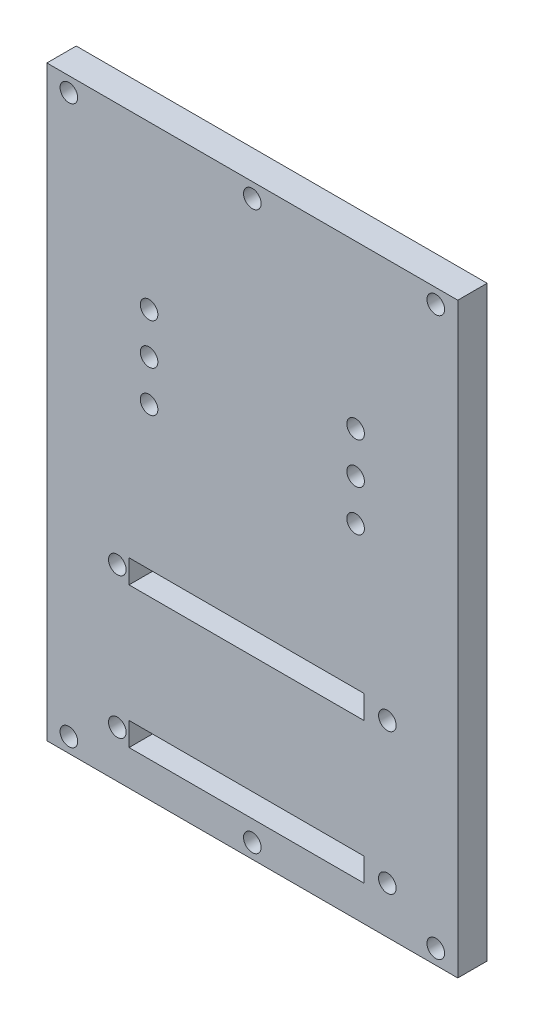
ISO-10303-21;
HEADER;
FILE_DESCRIPTION(('STEP AP214'),'2;1');
FILE_NAME('part.step','',(''),(''),'','','');
FILE_SCHEMA(('AUTOMOTIVE_DESIGN { 1 0 10303 214 1 1 1 1 }'));
ENDSEC;
DATA;
#1=APPLICATION_CONTEXT('core data for automotive mechanical design processes');
#2=APPLICATION_PROTOCOL_DEFINITION('international standard','automotive_design',2000,#1);
#3=PRODUCT_CONTEXT('',#1,'mechanical');
#4=PRODUCT('Part','Part','',(#3));
#5=PRODUCT_RELATED_PRODUCT_CATEGORY('part','',(#4));
#6=PRODUCT_DEFINITION_FORMATION('','',#4);
#7=PRODUCT_DEFINITION_CONTEXT('part definition',#1,'design');
#8=PRODUCT_DEFINITION('design','',#6,#7);
#9=PRODUCT_DEFINITION_SHAPE('','',#8);
#10=(LENGTH_UNIT() NAMED_UNIT(*) SI_UNIT(.MILLI.,.METRE.));
#11=(NAMED_UNIT(*) PLANE_ANGLE_UNIT() SI_UNIT($,.RADIAN.));
#12=(NAMED_UNIT(*) SI_UNIT($,.STERADIAN.) SOLID_ANGLE_UNIT());
#13=UNCERTAINTY_MEASURE_WITH_UNIT(LENGTH_MEASURE(1.E-05),#10,'distance_accuracy_value','');
#14=(GEOMETRIC_REPRESENTATION_CONTEXT(3) GLOBAL_UNCERTAINTY_ASSIGNED_CONTEXT((#13)) GLOBAL_UNIT_ASSIGNED_CONTEXT((#10,
#11,#12)) REPRESENTATION_CONTEXT('',''));
#15=CARTESIAN_POINT('',(0.,0.,0.));
#16=DIRECTION('',(0.,0.,1.));
#17=DIRECTION('',(1.,0.,0.));
#18=AXIS2_PLACEMENT_3D('',#15,#16,#17);
#19=CARTESIAN_POINT('',(0.,0.,2.5));
#20=DIRECTION('',(0.,0.,-1.));
#21=DIRECTION('',(-1.,0.,0.));
#22=AXIS2_PLACEMENT_3D('',#19,#20,#21);
#23=PLANE('',#22);
#24=CARTESIAN_POINT('',(23.,-42.,2.5));
#25=DIRECTION('',(0.,0.,1.));
#26=DIRECTION('',(1.,0.,0.));
#27=AXIS2_PLACEMENT_3D('',#24,#25,#26);
#28=CIRCLE('',#27,1.5);
#29=CARTESIAN_POINT('',(24.5,-42.,2.5));
#30=VERTEX_POINT('',#29);
#31=EDGE_CURVE('E181',#30,#30,#28,.T.);
#32=ORIENTED_EDGE('',*,*,#31,.F.);
#33=EDGE_LOOP('',(#32));
#34=FACE_BOUND('',#33,.T.);
#35=CARTESIAN_POINT('',(-17.5949785190877,15.3212862437457,2.5));
#36=DIRECTION('',(0.,0.,1.));
#37=DIRECTION('',(1.,0.,0.));
#38=AXIS2_PLACEMENT_3D('',#35,#36,#37);
#39=CIRCLE('',#38,1.5);
#40=CARTESIAN_POINT('',(-16.0949785190877,15.3212862437457,2.5));
#41=VERTEX_POINT('',#40);
#42=EDGE_CURVE('E176',#41,#41,#39,.T.);
#43=ORIENTED_EDGE('',*,*,#42,.F.);
#44=EDGE_LOOP('',(#43));
#45=FACE_BOUND('',#44,.T.);
#46=CARTESIAN_POINT('',(-17.5949785190877,22.3212862437471,2.5));
#47=DIRECTION('',(0.,0.,1.));
#48=DIRECTION('',(1.,0.,0.));
#49=AXIS2_PLACEMENT_3D('',#46,#47,#48);
#50=CIRCLE('',#49,1.5);
#51=CARTESIAN_POINT('',(-16.0949785190877,22.3212862437471,2.5));
#52=VERTEX_POINT('',#51);
#53=EDGE_CURVE('E178',#52,#52,#50,.T.);
#54=ORIENTED_EDGE('',*,*,#53,.F.);
#55=EDGE_LOOP('',(#54));
#56=FACE_BOUND('',#55,.T.);
#57=CARTESIAN_POINT('',(-17.5949785190876,8.32128624374423,2.5));
#58=DIRECTION('',(0.,0.,1.));
#59=DIRECTION('',(1.,0.,0.));
#60=AXIS2_PLACEMENT_3D('',#57,#58,#59);
#61=CIRCLE('',#60,1.5);
#62=CARTESIAN_POINT('',(-16.0949785190876,8.32128624374423,2.5));
#63=VERTEX_POINT('',#62);
#64=EDGE_CURVE('E147',#63,#63,#61,.T.);
#65=ORIENTED_EDGE('',*,*,#64,.F.);
#66=EDGE_LOOP('',(#65));
#67=FACE_BOUND('',#66,.T.);
#68=DIRECTION('',(0.,-1.,0.));
#69=VECTOR('',#68,1.);
#70=CARTESIAN_POINT('',(19.,-16.,2.5));
#71=LINE('',#70,#69);
#72=CARTESIAN_POINT('',(19.,-16.,2.5));
#73=VERTEX_POINT('',#72);
#74=CARTESIAN_POINT('',(19.,-20.,2.5));
#75=VERTEX_POINT('',#74);
#76=EDGE_CURVE('E149',#73,#75,#71,.T.);
#77=ORIENTED_EDGE('',*,*,#76,.T.);
#78=DIRECTION('',(1.,0.,0.));
#79=VECTOR('',#78,1.);
#80=CARTESIAN_POINT('',(-21.,-20.,2.5));
#81=LINE('',#80,#79);
#82=CARTESIAN_POINT('',(-21.,-20.,2.5));
#83=VERTEX_POINT('',#82);
#84=EDGE_CURVE('E54',#83,#75,#81,.T.);
#85=ORIENTED_EDGE('',*,*,#84,.F.);
#86=DIRECTION('',(0.,-1.,0.));
#87=VECTOR('',#86,1.);
#88=CARTESIAN_POINT('',(-21.,-16.,2.5));
#89=LINE('',#88,#87);
#90=CARTESIAN_POINT('',(-21.,-16.,2.5));
#91=VERTEX_POINT('',#90);
#92=EDGE_CURVE('E140',#91,#83,#89,.T.);
#93=ORIENTED_EDGE('',*,*,#92,.F.);
#94=DIRECTION('',(1.,0.,0.));
#95=VECTOR('',#94,1.);
#96=CARTESIAN_POINT('',(-21.,-16.,2.5));
#97=LINE('',#96,#95);
#98=EDGE_CURVE('E141',#91,#73,#97,.T.);
#99=ORIENTED_EDGE('',*,*,#98,.T.);
#100=EDGE_LOOP('',(#77,#85,#93,#99));
#101=FACE_BOUND('',#100,.T.);
#102=CARTESIAN_POINT('',(31.25,-47.5,2.5));
#103=DIRECTION('',(0.,0.,1.));
#104=DIRECTION('',(-1.,0.,0.));
#105=AXIS2_PLACEMENT_3D('',#102,#103,#104);
#106=CIRCLE('',#105,1.5);
#107=CARTESIAN_POINT('',(29.75,-47.5,2.5));
#108=VERTEX_POINT('',#107);
#109=EDGE_CURVE('E201',#108,#108,#106,.T.);
#110=ORIENTED_EDGE('',*,*,#109,.F.);
#111=EDGE_LOOP('',(#110));
#112=FACE_BOUND('',#111,.T.);
#113=CARTESIAN_POINT('',(-31.25,-47.5,2.5));
#114=DIRECTION('',(0.,0.,-1.));
#115=DIRECTION('',(1.,0.,0.));
#116=AXIS2_PLACEMENT_3D('',#113,#114,#115);
#117=CIRCLE('',#116,1.5);
#118=CARTESIAN_POINT('',(-29.75,-47.5,2.5));
#119=VERTEX_POINT('',#118);
#120=EDGE_CURVE('E210',#119,#119,#117,.T.);
#121=ORIENTED_EDGE('',*,*,#120,.T.);
#122=EDGE_LOOP('',(#121));
#123=FACE_BOUND('',#122,.T.);
#124=CARTESIAN_POINT('',(0.,-47.5,2.5));
#125=DIRECTION('',(0.,0.,-1.));
#126=DIRECTION('',(1.,0.,0.));
#127=AXIS2_PLACEMENT_3D('',#124,#125,#126);
#128=CIRCLE('',#127,1.5);
#129=CARTESIAN_POINT('',(1.5,-47.5,2.5));
#130=VERTEX_POINT('',#129);
#131=EDGE_CURVE('E209',#130,#130,#128,.T.);
#132=ORIENTED_EDGE('',*,*,#131,.T.);
#133=EDGE_LOOP('',(#132));
#134=FACE_BOUND('',#133,.T.);
#135=CARTESIAN_POINT('',(-31.25,47.5,2.5));
#136=DIRECTION('',(0.,0.,1.));
#137=DIRECTION('',(1.,0.,0.));
#138=AXIS2_PLACEMENT_3D('',#135,#136,#137);
#139=CIRCLE('',#138,1.5);
#140=CARTESIAN_POINT('',(-29.75,47.5,2.5));
#141=VERTEX_POINT('',#140);
#142=EDGE_CURVE('E220',#141,#141,#139,.T.);
#143=ORIENTED_EDGE('',*,*,#142,.F.);
#144=EDGE_LOOP('',(#143));
#145=FACE_BOUND('',#144,.T.);
#146=CARTESIAN_POINT('',(0.,47.5,2.5));
#147=DIRECTION('',(0.,0.,1.));
#148=DIRECTION('',(1.,0.,0.));
#149=AXIS2_PLACEMENT_3D('',#146,#147,#148);
#150=CIRCLE('',#149,1.5);
#151=CARTESIAN_POINT('',(1.5,47.5,2.5));
#152=VERTEX_POINT('',#151);
#153=EDGE_CURVE('E219',#152,#152,#150,.T.);
#154=ORIENTED_EDGE('',*,*,#153,.F.);
#155=EDGE_LOOP('',(#154));
#156=FACE_BOUND('',#155,.T.);
#157=DIRECTION('',(0.,1.,0.));
#158=VECTOR('',#157,1.);
#159=CARTESIAN_POINT('',(35.,-50.,2.5));
#160=LINE('',#159,#158);
#161=CARTESIAN_POINT('',(35.,-50.,2.5));
#162=VERTEX_POINT('',#161);
#163=CARTESIAN_POINT('',(35.,50.,2.5));
#164=VERTEX_POINT('',#163);
#165=EDGE_CURVE('E221',#162,#164,#160,.T.);
#166=ORIENTED_EDGE('',*,*,#165,.T.);
#167=DIRECTION('',(-1.,0.,0.));
#168=VECTOR('',#167,1.);
#169=CARTESIAN_POINT('',(-35.,50.,2.5));
#170=LINE('',#169,#168);
#171=CARTESIAN_POINT('',(-35.,50.,2.5));
#172=VERTEX_POINT('',#171);
#173=EDGE_CURVE('E229',#164,#172,#170,.T.);
#174=ORIENTED_EDGE('',*,*,#173,.T.);
#175=DIRECTION('',(0.,-1.,0.));
#176=VECTOR('',#175,1.);
#177=CARTESIAN_POINT('',(-35.,-50.,2.5));
#178=LINE('',#177,#176);
#179=CARTESIAN_POINT('',(-35.,-50.,2.5));
#180=VERTEX_POINT('',#179);
#181=EDGE_CURVE('E226',#172,#180,#178,.T.);
#182=ORIENTED_EDGE('',*,*,#181,.T.);
#183=DIRECTION('',(1.,0.,0.));
#184=VECTOR('',#183,1.);
#185=CARTESIAN_POINT('',(-35.,-50.,2.5));
#186=LINE('',#185,#184);
#187=EDGE_CURVE('E235',#180,#162,#186,.T.);
#188=ORIENTED_EDGE('',*,*,#187,.T.);
#189=EDGE_LOOP('',(#166,#174,#182,#188));
#190=FACE_BOUND('',#189,.T.);
#191=CARTESIAN_POINT('',(31.25,47.5,2.5));
#192=DIRECTION('',(0.,0.,-1.));
#193=DIRECTION('',(-1.,0.,0.));
#194=AXIS2_PLACEMENT_3D('',#191,#192,#193);
#195=CIRCLE('',#194,1.5);
#196=CARTESIAN_POINT('',(29.75,47.5,2.5));
#197=VERTEX_POINT('',#196);
#198=EDGE_CURVE('E213',#197,#197,#195,.T.);
#199=ORIENTED_EDGE('',*,*,#198,.T.);
#200=EDGE_LOOP('',(#199));
#201=FACE_BOUND('',#200,.T.);
#202=CARTESIAN_POINT('',(-23.,-18.,2.5));
#203=DIRECTION('',(0.,0.,1.));
#204=DIRECTION('',(1.,0.,0.));
#205=AXIS2_PLACEMENT_3D('',#202,#203,#204);
#206=CIRCLE('',#205,1.5);
#207=CARTESIAN_POINT('',(-21.5,-18.,2.5));
#208=VERTEX_POINT('',#207);
#209=EDGE_CURVE('E191',#208,#208,#206,.T.);
#210=ORIENTED_EDGE('',*,*,#209,.F.);
#211=EDGE_LOOP('',(#210));
#212=FACE_BOUND('',#211,.T.);
#213=DIRECTION('',(0.,1.,0.));
#214=VECTOR('',#213,1.);
#215=CARTESIAN_POINT('',(-21.,-44.,2.5));
#216=LINE('',#215,#214);
#217=CARTESIAN_POINT('',(-21.,-44.,2.5));
#218=VERTEX_POINT('',#217);
#219=CARTESIAN_POINT('',(-21.,-40.,2.5));
#220=VERTEX_POINT('',#219);
#221=EDGE_CURVE('E62',#218,#220,#216,.T.);
#222=ORIENTED_EDGE('',*,*,#221,.T.);
#223=DIRECTION('',(1.,0.,0.));
#224=VECTOR('',#223,1.);
#225=CARTESIAN_POINT('',(-21.,-40.,2.5));
#226=LINE('',#225,#224);
#227=CARTESIAN_POINT('',(19.,-40.,2.5));
#228=VERTEX_POINT('',#227);
#229=EDGE_CURVE('E174',#220,#228,#226,.T.);
#230=ORIENTED_EDGE('',*,*,#229,.T.);
#231=DIRECTION('',(0.,1.,0.));
#232=VECTOR('',#231,1.);
#233=CARTESIAN_POINT('',(19.,-44.,2.5));
#234=LINE('',#233,#232);
#235=CARTESIAN_POINT('',(19.,-44.,2.5));
#236=VERTEX_POINT('',#235);
#237=EDGE_CURVE('E166',#236,#228,#234,.T.);
#238=ORIENTED_EDGE('',*,*,#237,.F.);
#239=DIRECTION('',(1.,0.,0.));
#240=VECTOR('',#239,1.);
#241=CARTESIAN_POINT('',(-21.,-44.,2.5));
#242=LINE('',#241,#240);
#243=EDGE_CURVE('E167',#218,#236,#242,.T.);
#244=ORIENTED_EDGE('',*,*,#243,.F.);
#245=EDGE_LOOP('',(#222,#230,#238,#244));
#246=FACE_BOUND('',#245,.T.);
#247=CARTESIAN_POINT('',(17.5949785190876,8.32128624374423,2.5));
#248=DIRECTION('',(0.,0.,-1.));
#249=DIRECTION('',(-1.,0.,0.));
#250=AXIS2_PLACEMENT_3D('',#247,#248,#249);
#251=CIRCLE('',#250,1.5);
#252=CARTESIAN_POINT('',(16.0949785190876,8.32128624374423,2.5));
#253=VERTEX_POINT('',#252);
#254=EDGE_CURVE('E187',#253,#253,#251,.T.);
#255=ORIENTED_EDGE('',*,*,#254,.T.);
#256=EDGE_LOOP('',(#255));
#257=FACE_BOUND('',#256,.T.);
#258=CARTESIAN_POINT('',(17.5949785190877,15.3212862437457,2.5));
#259=DIRECTION('',(0.,0.,-1.));
#260=DIRECTION('',(-1.,0.,0.));
#261=AXIS2_PLACEMENT_3D('',#258,#259,#260);
#262=CIRCLE('',#261,1.5);
#263=CARTESIAN_POINT('',(16.0949785190877,15.3212862437457,2.5));
#264=VERTEX_POINT('',#263);
#265=EDGE_CURVE('E195',#264,#264,#262,.T.);
#266=ORIENTED_EDGE('',*,*,#265,.T.);
#267=EDGE_LOOP('',(#266));
#268=FACE_BOUND('',#267,.T.);
#269=CARTESIAN_POINT('',(17.5949785190877,22.3212862437471,2.5));
#270=DIRECTION('',(0.,0.,-1.));
#271=DIRECTION('',(-1.,0.,0.));
#272=AXIS2_PLACEMENT_3D('',#269,#270,#271);
#273=CIRCLE('',#272,1.5);
#274=CARTESIAN_POINT('',(16.0949785190877,22.3212862437471,2.5));
#275=VERTEX_POINT('',#274);
#276=EDGE_CURVE('E194',#275,#275,#273,.T.);
#277=ORIENTED_EDGE('',*,*,#276,.T.);
#278=EDGE_LOOP('',(#277));
#279=FACE_BOUND('',#278,.T.);
#280=CARTESIAN_POINT('',(-23.,-42.,2.5));
#281=DIRECTION('',(0.,0.,-1.));
#282=DIRECTION('',(-1.,0.,0.));
#283=AXIS2_PLACEMENT_3D('',#280,#281,#282);
#284=CIRCLE('',#283,1.5);
#285=CARTESIAN_POINT('',(-24.5,-42.,2.5));
#286=VERTEX_POINT('',#285);
#287=EDGE_CURVE('E179',#286,#286,#284,.T.);
#288=ORIENTED_EDGE('',*,*,#287,.T.);
#289=EDGE_LOOP('',(#288));
#290=FACE_BOUND('',#289,.T.);
#291=CARTESIAN_POINT('',(23.,-18.,2.5));
#292=DIRECTION('',(0.,0.,-1.));
#293=DIRECTION('',(-1.,0.,0.));
#294=AXIS2_PLACEMENT_3D('',#291,#292,#293);
#295=CIRCLE('',#294,1.5);
#296=CARTESIAN_POINT('',(21.5,-18.,2.5));
#297=VERTEX_POINT('',#296);
#298=EDGE_CURVE('E153',#297,#297,#295,.T.);
#299=ORIENTED_EDGE('',*,*,#298,.T.);
#300=EDGE_LOOP('',(#299));
#301=FACE_BOUND('',#300,.T.);
#302=ADVANCED_FACE('F36',(#34,#45,#56,#67,#101,#112,#123,#134,#145,#156,#190,#201,#212,#246,
#257,#268,#279,#290,#301),#23,.F.);
#303=CARTESIAN_POINT('',(0.,0.,-2.5));
#304=DIRECTION('',(0.,0.,-1.));
#305=DIRECTION('',(-1.,0.,0.));
#306=AXIS2_PLACEMENT_3D('',#303,#304,#305);
#307=PLANE('',#306);
#308=CARTESIAN_POINT('',(-23.,-42.,-2.5));
#309=DIRECTION('',(0.,0.,-1.));
#310=DIRECTION('',(-1.,0.,0.));
#311=AXIS2_PLACEMENT_3D('',#308,#309,#310);
#312=CIRCLE('',#311,1.5);
#313=CARTESIAN_POINT('',(-24.5,-42.,-2.5));
#314=VERTEX_POINT('',#313);
#315=EDGE_CURVE('E307',#314,#314,#312,.F.);
#316=ORIENTED_EDGE('',*,*,#315,.T.);
#317=EDGE_LOOP('',(#316));
#318=FACE_BOUND('',#317,.T.);
#319=CARTESIAN_POINT('',(-17.5949785190877,15.3212862437457,-2.5));
#320=DIRECTION('',(0.,0.,-1.));
#321=DIRECTION('',(-1.,0.,0.));
#322=AXIS2_PLACEMENT_3D('',#319,#320,#321);
#323=CIRCLE('',#322,1.5);
#324=CARTESIAN_POINT('',(-19.0949785190877,15.3212862437457,-2.5));
#325=VERTEX_POINT('',#324);
#326=EDGE_CURVE('E303',#325,#325,#323,.T.);
#327=ORIENTED_EDGE('',*,*,#326,.F.);
#328=EDGE_LOOP('',(#327));
#329=FACE_BOUND('',#328,.T.);
#330=CARTESIAN_POINT('',(-17.5949785190877,22.3212862437471,-2.5));
#331=DIRECTION('',(0.,0.,-1.));
#332=DIRECTION('',(-1.,0.,0.));
#333=AXIS2_PLACEMENT_3D('',#330,#331,#332);
#334=CIRCLE('',#333,1.5);
#335=CARTESIAN_POINT('',(-19.0949785190877,22.3212862437471,-2.5));
#336=VERTEX_POINT('',#335);
#337=EDGE_CURVE('E301',#336,#336,#334,.T.);
#338=ORIENTED_EDGE('',*,*,#337,.F.);
#339=EDGE_LOOP('',(#338));
#340=FACE_BOUND('',#339,.T.);
#341=CARTESIAN_POINT('',(17.5949785190877,15.3212862437457,-2.5));
#342=DIRECTION('',(0.,0.,-1.));
#343=DIRECTION('',(-1.,0.,0.));
#344=AXIS2_PLACEMENT_3D('',#341,#342,#343);
#345=CIRCLE('',#344,1.5);
#346=CARTESIAN_POINT('',(16.0949785190877,15.3212862437457,-2.5));
#347=VERTEX_POINT('',#346);
#348=EDGE_CURVE('E293',#347,#347,#345,.F.);
#349=ORIENTED_EDGE('',*,*,#348,.T.);
#350=EDGE_LOOP('',(#349));
#351=FACE_BOUND('',#350,.T.);
#352=DIRECTION('',(-1.,0.,0.));
#353=VECTOR('',#352,1.);
#354=CARTESIAN_POINT('',(0.,-40.,-2.5));
#355=LINE('',#354,#353);
#356=CARTESIAN_POINT('',(19.,-40.,-2.5));
#357=VERTEX_POINT('',#356);
#358=CARTESIAN_POINT('',(-21.,-40.,-2.5));
#359=VERTEX_POINT('',#358);
#360=EDGE_CURVE('E280',#357,#359,#355,.T.);
#361=ORIENTED_EDGE('',*,*,#360,.T.);
#362=DIRECTION('',(0.,-1.,0.));
#363=VECTOR('',#362,1.);
#364=CARTESIAN_POINT('',(-21.,0.,-2.5));
#365=LINE('',#364,#363);
#366=CARTESIAN_POINT('',(-21.,-44.,-2.5));
#367=VERTEX_POINT('',#366);
#368=EDGE_CURVE('E278',#359,#367,#365,.T.);
#369=ORIENTED_EDGE('',*,*,#368,.T.);
#370=DIRECTION('',(-1.,0.,0.));
#371=VECTOR('',#370,1.);
#372=CARTESIAN_POINT('',(0.,-44.,-2.5));
#373=LINE('',#372,#371);
#374=CARTESIAN_POINT('',(19.,-44.,-2.5));
#375=VERTEX_POINT('',#374);
#376=EDGE_CURVE('E254',#375,#367,#373,.T.);
#377=ORIENTED_EDGE('',*,*,#376,.F.);
#378=DIRECTION('',(0.,-1.,0.));
#379=VECTOR('',#378,1.);
#380=CARTESIAN_POINT('',(19.,0.,-2.5));
#381=LINE('',#380,#379);
#382=EDGE_CURVE('E273',#357,#375,#381,.T.);
#383=ORIENTED_EDGE('',*,*,#382,.F.);
#384=EDGE_LOOP('',(#361,#369,#377,#383));
#385=FACE_BOUND('',#384,.T.);
#386=CARTESIAN_POINT('',(31.25,-47.5,-2.5));
#387=DIRECTION('',(0.,0.,-1.));
#388=DIRECTION('',(-1.,0.,0.));
#389=AXIS2_PLACEMENT_3D('',#386,#387,#388);
#390=CIRCLE('',#389,1.5);
#391=CARTESIAN_POINT('',(29.75,-47.5,-2.5));
#392=VERTEX_POINT('',#391);
#393=EDGE_CURVE('E224',#392,#392,#390,.T.);
#394=ORIENTED_EDGE('',*,*,#393,.F.);
#395=EDGE_LOOP('',(#394));
#396=FACE_BOUND('',#395,.T.);
#397=CARTESIAN_POINT('',(31.25,47.5,-2.5));
#398=DIRECTION('',(0.,0.,-1.));
#399=DIRECTION('',(-1.,0.,0.));
#400=AXIS2_PLACEMENT_3D('',#397,#398,#399);
#401=CIRCLE('',#400,1.5);
#402=CARTESIAN_POINT('',(29.75,47.5,-2.5));
#403=VERTEX_POINT('',#402);
#404=EDGE_CURVE('E239',#403,#403,#401,.F.);
#405=ORIENTED_EDGE('',*,*,#404,.T.);
#406=EDGE_LOOP('',(#405));
#407=FACE_BOUND('',#406,.T.);
#408=CARTESIAN_POINT('',(-31.25,47.5,-2.5));
#409=DIRECTION('',(0.,0.,-1.));
#410=DIRECTION('',(-1.,0.,0.));
#411=AXIS2_PLACEMENT_3D('',#408,#409,#410);
#412=CIRCLE('',#411,1.5);
#413=CARTESIAN_POINT('',(-32.75,47.5,-2.5));
#414=VERTEX_POINT('',#413);
#415=EDGE_CURVE('E256',#414,#414,#412,.T.);
#416=ORIENTED_EDGE('',*,*,#415,.F.);
#417=EDGE_LOOP('',(#416));
#418=FACE_BOUND('',#417,.T.);
#419=CARTESIAN_POINT('',(0.,47.5,-2.5));
#420=DIRECTION('',(0.,0.,-1.));
#421=DIRECTION('',(-1.,0.,0.));
#422=AXIS2_PLACEMENT_3D('',#419,#420,#421);
#423=CIRCLE('',#422,1.5);
#424=CARTESIAN_POINT('',(-1.5,47.5,-2.5));
#425=VERTEX_POINT('',#424);
#426=EDGE_CURVE('E216',#425,#425,#423,.T.);
#427=ORIENTED_EDGE('',*,*,#426,.F.);
#428=EDGE_LOOP('',(#427));
#429=FACE_BOUND('',#428,.T.);
#430=DIRECTION('',(0.,1.,0.));
#431=VECTOR('',#430,1.);
#432=CARTESIAN_POINT('',(35.,-50.,-2.5));
#433=LINE('',#432,#431);
#434=CARTESIAN_POINT('',(35.,-50.,-2.5));
#435=VERTEX_POINT('',#434);
#436=CARTESIAN_POINT('',(35.,50.,-2.5));
#437=VERTEX_POINT('',#436);
#438=EDGE_CURVE('E234',#435,#437,#433,.T.);
#439=ORIENTED_EDGE('',*,*,#438,.F.);
#440=DIRECTION('',(1.,0.,0.));
#441=VECTOR('',#440,1.);
#442=CARTESIAN_POINT('',(-35.,-50.,-2.5));
#443=LINE('',#442,#441);
#444=CARTESIAN_POINT('',(-35.,-50.,-2.5));
#445=VERTEX_POINT('',#444);
#446=EDGE_CURVE('E227',#445,#435,#443,.T.);
#447=ORIENTED_EDGE('',*,*,#446,.F.);
#448=DIRECTION('',(0.,-1.,0.));
#449=VECTOR('',#448,1.);
#450=CARTESIAN_POINT('',(-35.,-50.,-2.5));
#451=LINE('',#450,#449);
#452=CARTESIAN_POINT('',(-35.,50.,-2.5));
#453=VERTEX_POINT('',#452);
#454=EDGE_CURVE('E243',#453,#445,#451,.T.);
#455=ORIENTED_EDGE('',*,*,#454,.F.);
#456=DIRECTION('',(-1.,0.,0.));
#457=VECTOR('',#456,1.);
#458=CARTESIAN_POINT('',(-35.,50.,-2.5));
#459=LINE('',#458,#457);
#460=EDGE_CURVE('E236',#437,#453,#459,.T.);
#461=ORIENTED_EDGE('',*,*,#460,.F.);
#462=EDGE_LOOP('',(#439,#447,#455,#461));
#463=FACE_BOUND('',#462,.T.);
#464=CARTESIAN_POINT('',(0.,-47.5,-2.5));
#465=DIRECTION('',(0.,0.,-1.));
#466=DIRECTION('',(-1.,0.,0.));
#467=AXIS2_PLACEMENT_3D('',#464,#465,#466);
#468=CIRCLE('',#467,1.5);
#469=CARTESIAN_POINT('',(-1.5,-47.5,-2.5));
#470=VERTEX_POINT('',#469);
#471=EDGE_CURVE('E206',#470,#470,#468,.F.);
#472=ORIENTED_EDGE('',*,*,#471,.T.);
#473=EDGE_LOOP('',(#472));
#474=FACE_BOUND('',#473,.T.);
#475=CARTESIAN_POINT('',(-31.25,-47.5,-2.5));
#476=DIRECTION('',(0.,0.,-1.));
#477=DIRECTION('',(-1.,0.,0.));
#478=AXIS2_PLACEMENT_3D('',#475,#476,#477);
#479=CIRCLE('',#478,1.5);
#480=CARTESIAN_POINT('',(-32.75,-47.5,-2.5));
#481=VERTEX_POINT('',#480);
#482=EDGE_CURVE('E264',#481,#481,#479,.F.);
#483=ORIENTED_EDGE('',*,*,#482,.T.);
#484=EDGE_LOOP('',(#483));
#485=FACE_BOUND('',#484,.T.);
#486=CARTESIAN_POINT('',(-23.,-18.,-2.5));
#487=DIRECTION('',(0.,0.,-1.));
#488=DIRECTION('',(-1.,0.,0.));
#489=AXIS2_PLACEMENT_3D('',#486,#487,#488);
#490=CIRCLE('',#489,1.5);
#491=CARTESIAN_POINT('',(-24.5,-18.,-2.5));
#492=VERTEX_POINT('',#491);
#493=EDGE_CURVE('E205',#492,#492,#490,.T.);
#494=ORIENTED_EDGE('',*,*,#493,.F.);
#495=EDGE_LOOP('',(#494));
#496=FACE_BOUND('',#495,.T.);
#497=DIRECTION('',(-1.,0.,0.));
#498=VECTOR('',#497,1.);
#499=CARTESIAN_POINT('',(0.,-20.,-2.5));
#500=LINE('',#499,#498);
#501=CARTESIAN_POINT('',(19.,-20.,-2.5));
#502=VERTEX_POINT('',#501);
#503=CARTESIAN_POINT('',(-21.,-20.,-2.5));
#504=VERTEX_POINT('',#503);
#505=EDGE_CURVE('E11',#502,#504,#500,.T.);
#506=ORIENTED_EDGE('',*,*,#505,.F.);
#507=DIRECTION('',(0.,1.,0.));
#508=VECTOR('',#507,1.);
#509=CARTESIAN_POINT('',(19.,0.,-2.5));
#510=LINE('',#509,#508);
#511=CARTESIAN_POINT('',(19.,-16.,-2.5));
#512=VERTEX_POINT('',#511);
#513=EDGE_CURVE('E282',#502,#512,#510,.T.);
#514=ORIENTED_EDGE('',*,*,#513,.T.);
#515=DIRECTION('',(-1.,0.,0.));
#516=VECTOR('',#515,1.);
#517=CARTESIAN_POINT('',(0.,-16.,-2.5));
#518=LINE('',#517,#516);
#519=CARTESIAN_POINT('',(-21.,-16.,-2.5));
#520=VERTEX_POINT('',#519);
#521=EDGE_CURVE('E286',#512,#520,#518,.T.);
#522=ORIENTED_EDGE('',*,*,#521,.T.);
#523=DIRECTION('',(0.,1.,0.));
#524=VECTOR('',#523,1.);
#525=CARTESIAN_POINT('',(-21.,0.,-2.5));
#526=LINE('',#525,#524);
#527=EDGE_CURVE('E50',#504,#520,#526,.T.);
#528=ORIENTED_EDGE('',*,*,#527,.F.);
#529=EDGE_LOOP('',(#506,#514,#522,#528));
#530=FACE_BOUND('',#529,.T.);
#531=CARTESIAN_POINT('',(-17.5949785190876,8.32128624374423,-2.5));
#532=DIRECTION('',(0.,0.,-1.));
#533=DIRECTION('',(-1.,0.,0.));
#534=AXIS2_PLACEMENT_3D('',#531,#532,#533);
#535=CIRCLE('',#534,1.5);
#536=CARTESIAN_POINT('',(-19.0949785190876,8.32128624374423,-2.5));
#537=VERTEX_POINT('',#536);
#538=EDGE_CURVE('E275',#537,#537,#535,.T.);
#539=ORIENTED_EDGE('',*,*,#538,.F.);
#540=EDGE_LOOP('',(#539));
#541=FACE_BOUND('',#540,.T.);
#542=CARTESIAN_POINT('',(17.5949785190876,8.32128624374423,-2.5));
#543=DIRECTION('',(0.,0.,-1.));
#544=DIRECTION('',(-1.,0.,0.));
#545=AXIS2_PLACEMENT_3D('',#542,#543,#544);
#546=CIRCLE('',#545,1.5);
#547=CARTESIAN_POINT('',(16.0949785190876,8.32128624374423,-2.5));
#548=VERTEX_POINT('',#547);
#549=EDGE_CURVE('E295',#548,#548,#546,.F.);
#550=ORIENTED_EDGE('',*,*,#549,.T.);
#551=EDGE_LOOP('',(#550));
#552=FACE_BOUND('',#551,.T.);
#553=CARTESIAN_POINT('',(17.5949785190877,22.3212862437471,-2.5));
#554=DIRECTION('',(0.,0.,-1.));
#555=DIRECTION('',(-1.,0.,0.));
#556=AXIS2_PLACEMENT_3D('',#553,#554,#555);
#557=CIRCLE('',#556,1.5);
#558=CARTESIAN_POINT('',(16.0949785190877,22.3212862437471,-2.5));
#559=VERTEX_POINT('',#558);
#560=EDGE_CURVE('E297',#559,#559,#557,.F.);
#561=ORIENTED_EDGE('',*,*,#560,.T.);
#562=EDGE_LOOP('',(#561));
#563=FACE_BOUND('',#562,.T.);
#564=CARTESIAN_POINT('',(23.,-42.,-2.5));
#565=DIRECTION('',(0.,0.,-1.));
#566=DIRECTION('',(-1.,0.,0.));
#567=AXIS2_PLACEMENT_3D('',#564,#565,#566);
#568=CIRCLE('',#567,1.5);
#569=CARTESIAN_POINT('',(21.5,-42.,-2.5));
#570=VERTEX_POINT('',#569);
#571=EDGE_CURVE('E310',#570,#570,#568,.T.);
#572=ORIENTED_EDGE('',*,*,#571,.F.);
#573=EDGE_LOOP('',(#572));
#574=FACE_BOUND('',#573,.T.);
#575=CARTESIAN_POINT('',(23.,-18.,-2.5));
#576=DIRECTION('',(0.,0.,-1.));
#577=DIRECTION('',(-1.,0.,0.));
#578=AXIS2_PLACEMENT_3D('',#575,#576,#577);
#579=CIRCLE('',#578,1.5);
#580=CARTESIAN_POINT('',(21.5,-18.,-2.5));
#581=VERTEX_POINT('',#580);
#582=EDGE_CURVE('E45',#581,#581,#579,.F.);
#583=ORIENTED_EDGE('',*,*,#582,.T.);
#584=EDGE_LOOP('',(#583));
#585=FACE_BOUND('',#584,.T.);
#586=ADVANCED_FACE('F316',(#318,#329,#340,#351,#385,#396,#407,#418,#429,#463,#474,#485,#496,
#530,#541,#552,#563,#574,#585),#307,.T.);
#587=CARTESIAN_POINT('',(35.,-50.,2.5));
#588=DIRECTION('',(-1.,0.,0.));
#589=DIRECTION('',(0.,0.,1.));
#590=AXIS2_PLACEMENT_3D('',#587,#588,#589);
#591=PLANE('',#590);
#592=ORIENTED_EDGE('',*,*,#438,.T.);
#593=DIRECTION('',(0.,0.,-1.));
#594=VECTOR('',#593,1.);
#595=CARTESIAN_POINT('',(35.,50.,2.5));
#596=LINE('',#595,#594);
#597=EDGE_CURVE('E252',#164,#437,#596,.T.);
#598=ORIENTED_EDGE('',*,*,#597,.F.);
#599=ORIENTED_EDGE('',*,*,#165,.F.);
#600=DIRECTION('',(0.,0.,-1.));
#601=VECTOR('',#600,1.);
#602=CARTESIAN_POINT('',(35.,-50.,2.5));
#603=LINE('',#602,#601);
#604=EDGE_CURVE('E233',#162,#435,#603,.T.);
#605=ORIENTED_EDGE('',*,*,#604,.T.);
#606=EDGE_LOOP('',(#592,#598,#599,#605));
#607=FACE_BOUND('',#606,.T.);
#608=ADVANCED_FACE('F37',(#607),#591,.F.);
#609=CARTESIAN_POINT('',(-35.,50.,2.5));
#610=DIRECTION('',(0.,-1.,0.));
#611=DIRECTION('',(0.,0.,-1.));
#612=AXIS2_PLACEMENT_3D('',#609,#610,#611);
#613=PLANE('',#612);
#614=ORIENTED_EDGE('',*,*,#460,.T.);
#615=DIRECTION('',(0.,0.,-1.));
#616=VECTOR('',#615,1.);
#617=CARTESIAN_POINT('',(-35.,50.,2.5));
#618=LINE('',#617,#616);
#619=EDGE_CURVE('E248',#172,#453,#618,.T.);
#620=ORIENTED_EDGE('',*,*,#619,.F.);
#621=ORIENTED_EDGE('',*,*,#173,.F.);
#622=ORIENTED_EDGE('',*,*,#597,.T.);
#623=EDGE_LOOP('',(#614,#620,#621,#622));
#624=FACE_BOUND('',#623,.T.);
#625=ADVANCED_FACE('F347',(#624),#613,.F.);
#626=CARTESIAN_POINT('',(-35.,-50.,2.5));
#627=DIRECTION('',(1.,0.,0.));
#628=DIRECTION('',(0.,0.,-1.));
#629=AXIS2_PLACEMENT_3D('',#626,#627,#628);
#630=PLANE('',#629);
#631=ORIENTED_EDGE('',*,*,#454,.T.);
#632=DIRECTION('',(0.,0.,-1.));
#633=VECTOR('',#632,1.);
#634=CARTESIAN_POINT('',(-35.,-50.,2.5));
#635=LINE('',#634,#633);
#636=EDGE_CURVE('E246',#180,#445,#635,.T.);
#637=ORIENTED_EDGE('',*,*,#636,.F.);
#638=ORIENTED_EDGE('',*,*,#181,.F.);
#639=ORIENTED_EDGE('',*,*,#619,.T.);
#640=EDGE_LOOP('',(#631,#637,#638,#639));
#641=FACE_BOUND('',#640,.T.);
#642=ADVANCED_FACE('F342',(#641),#630,.F.);
#643=CARTESIAN_POINT('',(-35.,-50.,2.5));
#644=DIRECTION('',(0.,1.,0.));
#645=DIRECTION('',(0.,0.,1.));
#646=AXIS2_PLACEMENT_3D('',#643,#644,#645);
#647=PLANE('',#646);
#648=ORIENTED_EDGE('',*,*,#446,.T.);
#649=ORIENTED_EDGE('',*,*,#604,.F.);
#650=ORIENTED_EDGE('',*,*,#187,.F.);
#651=ORIENTED_EDGE('',*,*,#636,.T.);
#652=EDGE_LOOP('',(#648,#649,#650,#651));
#653=FACE_BOUND('',#652,.T.);
#654=ADVANCED_FACE('F336',(#653),#647,.F.);
#655=CARTESIAN_POINT('',(0.,47.5,-8.5));
#656=DIRECTION('',(0.,0.,1.));
#657=DIRECTION('',(1.,0.,0.));
#658=AXIS2_PLACEMENT_3D('',#655,#656,#657);
#659=CYLINDRICAL_SURFACE('',#658,1.5);
#660=ORIENTED_EDGE('',*,*,#426,.T.);
#661=EDGE_LOOP('',(#660));
#662=FACE_BOUND('',#661,.T.);
#663=ORIENTED_EDGE('',*,*,#153,.T.);
#664=EDGE_LOOP('',(#663));
#665=FACE_BOUND('',#664,.T.);
#666=ADVANCED_FACE('F339',(#662,#665),#659,.F.);
#667=CARTESIAN_POINT('',(-31.25,47.5,-8.5));
#668=DIRECTION('',(0.,0.,1.));
#669=DIRECTION('',(1.,0.,0.));
#670=AXIS2_PLACEMENT_3D('',#667,#668,#669);
#671=CYLINDRICAL_SURFACE('',#670,1.5);
#672=ORIENTED_EDGE('',*,*,#415,.T.);
#673=EDGE_LOOP('',(#672));
#674=FACE_BOUND('',#673,.T.);
#675=ORIENTED_EDGE('',*,*,#142,.T.);
#676=EDGE_LOOP('',(#675));
#677=FACE_BOUND('',#676,.T.);
#678=ADVANCED_FACE('F435',(#674,#677),#671,.F.);
#679=CARTESIAN_POINT('',(31.25,47.5,-8.5));
#680=DIRECTION('',(0.,0.,1.));
#681=DIRECTION('',(1.,0.,0.));
#682=AXIS2_PLACEMENT_3D('',#679,#680,#681);
#683=CYLINDRICAL_SURFACE('',#682,1.5);
#684=ORIENTED_EDGE('',*,*,#404,.F.);
#685=EDGE_LOOP('',(#684));
#686=FACE_BOUND('',#685,.T.);
#687=ORIENTED_EDGE('',*,*,#198,.F.);
#688=EDGE_LOOP('',(#687));
#689=FACE_BOUND('',#688,.T.);
#690=ADVANCED_FACE('F427',(#686,#689),#683,.F.);
#691=CARTESIAN_POINT('',(0.,-47.5,-8.5));
#692=DIRECTION('',(0.,0.,1.));
#693=DIRECTION('',(1.,0.,0.));
#694=AXIS2_PLACEMENT_3D('',#691,#692,#693);
#695=CYLINDRICAL_SURFACE('',#694,1.5);
#696=ORIENTED_EDGE('',*,*,#471,.F.);
#697=EDGE_LOOP('',(#696));
#698=FACE_BOUND('',#697,.T.);
#699=ORIENTED_EDGE('',*,*,#131,.F.);
#700=EDGE_LOOP('',(#699));
#701=FACE_BOUND('',#700,.T.);
#702=ADVANCED_FACE('F422',(#698,#701),#695,.F.);
#703=CARTESIAN_POINT('',(-31.25,-47.5,-8.5));
#704=DIRECTION('',(0.,0.,1.));
#705=DIRECTION('',(1.,0.,0.));
#706=AXIS2_PLACEMENT_3D('',#703,#704,#705);
#707=CYLINDRICAL_SURFACE('',#706,1.5);
#708=ORIENTED_EDGE('',*,*,#482,.F.);
#709=EDGE_LOOP('',(#708));
#710=FACE_BOUND('',#709,.T.);
#711=ORIENTED_EDGE('',*,*,#120,.F.);
#712=EDGE_LOOP('',(#711));
#713=FACE_BOUND('',#712,.T.);
#714=ADVANCED_FACE('F423',(#710,#713),#707,.F.);
#715=CARTESIAN_POINT('',(31.25,-47.5,-8.5));
#716=DIRECTION('',(0.,0.,1.));
#717=DIRECTION('',(1.,0.,0.));
#718=AXIS2_PLACEMENT_3D('',#715,#716,#717);
#719=CYLINDRICAL_SURFACE('',#718,1.5);
#720=ORIENTED_EDGE('',*,*,#393,.T.);
#721=EDGE_LOOP('',(#720));
#722=FACE_BOUND('',#721,.T.);
#723=ORIENTED_EDGE('',*,*,#109,.T.);
#724=EDGE_LOOP('',(#723));
#725=FACE_BOUND('',#724,.T.);
#726=ADVANCED_FACE('F416',(#722,#725),#719,.F.);
#727=CARTESIAN_POINT('',(-23.,-18.,-7.5));
#728=DIRECTION('',(0.,0.,1.));
#729=DIRECTION('',(1.,0.,0.));
#730=AXIS2_PLACEMENT_3D('',#727,#728,#729);
#731=CYLINDRICAL_SURFACE('',#730,1.5);
#732=ORIENTED_EDGE('',*,*,#493,.T.);
#733=EDGE_LOOP('',(#732));
#734=FACE_BOUND('',#733,.T.);
#735=ORIENTED_EDGE('',*,*,#209,.T.);
#736=EDGE_LOOP('',(#735));
#737=FACE_BOUND('',#736,.T.);
#738=ADVANCED_FACE('F413',(#734,#737),#731,.F.);
#739=CARTESIAN_POINT('',(-21.,-44.,-7.5));
#740=DIRECTION('',(1.,0.,0.));
#741=DIRECTION('',(0.,1.,0.));
#742=AXIS2_PLACEMENT_3D('',#739,#740,#741);
#743=PLANE('',#742);
#744=DIRECTION('',(0.,0.,1.));
#745=VECTOR('',#744,1.);
#746=CARTESIAN_POINT('',(-21.,-40.,-7.5));
#747=LINE('',#746,#745);
#748=EDGE_CURVE('E158',#359,#220,#747,.T.);
#749=ORIENTED_EDGE('',*,*,#748,.T.);
#750=ORIENTED_EDGE('',*,*,#221,.F.);
#751=DIRECTION('',(0.,0.,1.));
#752=VECTOR('',#751,1.);
#753=CARTESIAN_POINT('',(-21.,-44.,-7.5));
#754=LINE('',#753,#752);
#755=EDGE_CURVE('E163',#367,#218,#754,.T.);
#756=ORIENTED_EDGE('',*,*,#755,.F.);
#757=ORIENTED_EDGE('',*,*,#368,.F.);
#758=EDGE_LOOP('',(#749,#750,#756,#757));
#759=FACE_BOUND('',#758,.T.);
#760=ADVANCED_FACE('F417',(#759),#743,.T.);
#761=CARTESIAN_POINT('',(-21.,-40.,-7.5));
#762=DIRECTION('',(0.,-1.,0.));
#763=DIRECTION('',(1.,0.,0.));
#764=AXIS2_PLACEMENT_3D('',#761,#762,#763);
#765=PLANE('',#764);
#766=DIRECTION('',(0.,0.,1.));
#767=VECTOR('',#766,1.);
#768=CARTESIAN_POINT('',(19.,-40.,-7.5));
#769=LINE('',#768,#767);
#770=EDGE_CURVE('E159',#357,#228,#769,.T.);
#771=ORIENTED_EDGE('',*,*,#770,.T.);
#772=ORIENTED_EDGE('',*,*,#229,.F.);
#773=ORIENTED_EDGE('',*,*,#748,.F.);
#774=ORIENTED_EDGE('',*,*,#360,.F.);
#775=EDGE_LOOP('',(#771,#772,#773,#774));
#776=FACE_BOUND('',#775,.T.);
#777=ADVANCED_FACE('F521',(#776),#765,.T.);
#778=CARTESIAN_POINT('',(19.,-44.,-7.5));
#779=DIRECTION('',(1.,0.,0.));
#780=DIRECTION('',(0.,1.,0.));
#781=AXIS2_PLACEMENT_3D('',#778,#779,#780);
#782=PLANE('',#781);
#783=ORIENTED_EDGE('',*,*,#382,.T.);
#784=DIRECTION('',(0.,0.,1.));
#785=VECTOR('',#784,1.);
#786=CARTESIAN_POINT('',(19.,-44.,-7.5));
#787=LINE('',#786,#785);
#788=EDGE_CURVE('E165',#375,#236,#787,.T.);
#789=ORIENTED_EDGE('',*,*,#788,.T.);
#790=ORIENTED_EDGE('',*,*,#237,.T.);
#791=ORIENTED_EDGE('',*,*,#770,.F.);
#792=EDGE_LOOP('',(#783,#789,#790,#791));
#793=FACE_BOUND('',#792,.T.);
#794=ADVANCED_FACE('F530',(#793),#782,.F.);
#795=CARTESIAN_POINT('',(-21.,-44.,-7.5));
#796=DIRECTION('',(0.,-1.,0.));
#797=DIRECTION('',(0.,0.,-1.));
#798=AXIS2_PLACEMENT_3D('',#795,#796,#797);
#799=PLANE('',#798);
#800=ORIENTED_EDGE('',*,*,#376,.T.);
#801=ORIENTED_EDGE('',*,*,#755,.T.);
#802=ORIENTED_EDGE('',*,*,#243,.T.);
#803=ORIENTED_EDGE('',*,*,#788,.F.);
#804=EDGE_LOOP('',(#800,#801,#802,#803));
#805=FACE_BOUND('',#804,.T.);
#806=ADVANCED_FACE('F538',(#805),#799,.F.);
#807=CARTESIAN_POINT('',(-21.,-20.,-7.5));
#808=DIRECTION('',(0.,-1.,0.));
#809=DIRECTION('',(1.,0.,0.));
#810=AXIS2_PLACEMENT_3D('',#807,#808,#809);
#811=PLANE('',#810);
#812=ORIENTED_EDGE('',*,*,#505,.T.);
#813=DIRECTION('',(0.,0.,1.));
#814=VECTOR('',#813,1.);
#815=CARTESIAN_POINT('',(-21.,-20.,-7.5));
#816=LINE('',#815,#814);
#817=EDGE_CURVE('E126',#504,#83,#816,.T.);
#818=ORIENTED_EDGE('',*,*,#817,.T.);
#819=ORIENTED_EDGE('',*,*,#84,.T.);
#820=DIRECTION('',(0.,0.,1.));
#821=VECTOR('',#820,1.);
#822=CARTESIAN_POINT('',(19.,-20.,-7.5));
#823=LINE('',#822,#821);
#824=EDGE_CURVE('E145',#502,#75,#823,.T.);
#825=ORIENTED_EDGE('',*,*,#824,.F.);
#826=EDGE_LOOP('',(#812,#818,#819,#825));
#827=FACE_BOUND('',#826,.T.);
#828=ADVANCED_FACE('F128',(#827),#811,.F.);
#829=CARTESIAN_POINT('',(-21.,-16.,-7.5));
#830=DIRECTION('',(-1.,0.,0.));
#831=DIRECTION('',(0.,-1.,0.));
#832=AXIS2_PLACEMENT_3D('',#829,#830,#831);
#833=PLANE('',#832);
#834=ORIENTED_EDGE('',*,*,#527,.T.);
#835=DIRECTION('',(0.,0.,1.));
#836=VECTOR('',#835,1.);
#837=CARTESIAN_POINT('',(-21.,-16.,-7.5));
#838=LINE('',#837,#836);
#839=EDGE_CURVE('E135',#520,#91,#838,.T.);
#840=ORIENTED_EDGE('',*,*,#839,.T.);
#841=ORIENTED_EDGE('',*,*,#92,.T.);
#842=ORIENTED_EDGE('',*,*,#817,.F.);
#843=EDGE_LOOP('',(#834,#840,#841,#842));
#844=FACE_BOUND('',#843,.T.);
#845=ADVANCED_FACE('F137',(#844),#833,.F.);
#846=CARTESIAN_POINT('',(-21.,-16.,-7.5));
#847=DIRECTION('',(0.,-1.,0.));
#848=DIRECTION('',(1.,0.,0.));
#849=AXIS2_PLACEMENT_3D('',#846,#847,#848);
#850=PLANE('',#849);
#851=DIRECTION('',(0.,0.,1.));
#852=VECTOR('',#851,1.);
#853=CARTESIAN_POINT('',(19.,-16.,-7.5));
#854=LINE('',#853,#852);
#855=EDGE_CURVE('E657',#512,#73,#854,.T.);
#856=ORIENTED_EDGE('',*,*,#855,.T.);
#857=ORIENTED_EDGE('',*,*,#98,.F.);
#858=ORIENTED_EDGE('',*,*,#839,.F.);
#859=ORIENTED_EDGE('',*,*,#521,.F.);
#860=EDGE_LOOP('',(#856,#857,#858,#859));
#861=FACE_BOUND('',#860,.T.);
#862=ADVANCED_FACE('F561',(#861),#850,.T.);
#863=CARTESIAN_POINT('',(19.,-16.,-7.5));
#864=DIRECTION('',(-1.,0.,0.));
#865=DIRECTION('',(0.,-1.,0.));
#866=AXIS2_PLACEMENT_3D('',#863,#864,#865);
#867=PLANE('',#866);
#868=ORIENTED_EDGE('',*,*,#824,.T.);
#869=ORIENTED_EDGE('',*,*,#76,.F.);
#870=ORIENTED_EDGE('',*,*,#855,.F.);
#871=ORIENTED_EDGE('',*,*,#513,.F.);
#872=EDGE_LOOP('',(#868,#869,#870,#871));
#873=FACE_BOUND('',#872,.T.);
#874=ADVANCED_FACE('F569',(#873),#867,.T.);
#875=CARTESIAN_POINT('',(-17.5949785190876,8.32128624374423,-7.5));
#876=DIRECTION('',(0.,0.,1.));
#877=DIRECTION('',(1.,0.,0.));
#878=AXIS2_PLACEMENT_3D('',#875,#876,#877);
#879=CYLINDRICAL_SURFACE('',#878,1.5);
#880=ORIENTED_EDGE('',*,*,#538,.T.);
#881=EDGE_LOOP('',(#880));
#882=FACE_BOUND('',#881,.T.);
#883=ORIENTED_EDGE('',*,*,#64,.T.);
#884=EDGE_LOOP('',(#883));
#885=FACE_BOUND('',#884,.T.);
#886=ADVANCED_FACE('F405',(#882,#885),#879,.F.);
#887=CARTESIAN_POINT('',(17.5949785190876,8.32128624374423,-7.5));
#888=DIRECTION('',(0.,0.,1.));
#889=DIRECTION('',(1.,0.,0.));
#890=AXIS2_PLACEMENT_3D('',#887,#888,#889);
#891=CYLINDRICAL_SURFACE('',#890,1.5);
#892=ORIENTED_EDGE('',*,*,#549,.F.);
#893=EDGE_LOOP('',(#892));
#894=FACE_BOUND('',#893,.T.);
#895=ORIENTED_EDGE('',*,*,#254,.F.);
#896=EDGE_LOOP('',(#895));
#897=FACE_BOUND('',#896,.T.);
#898=ADVANCED_FACE('F397',(#894,#897),#891,.F.);
#899=CARTESIAN_POINT('',(17.5949785190877,15.3212862437457,-7.5));
#900=DIRECTION('',(0.,0.,1.));
#901=DIRECTION('',(1.,0.,0.));
#902=AXIS2_PLACEMENT_3D('',#899,#900,#901);
#903=CYLINDRICAL_SURFACE('',#902,1.5);
#904=ORIENTED_EDGE('',*,*,#348,.F.);
#905=EDGE_LOOP('',(#904));
#906=FACE_BOUND('',#905,.T.);
#907=ORIENTED_EDGE('',*,*,#265,.F.);
#908=EDGE_LOOP('',(#907));
#909=FACE_BOUND('',#908,.T.);
#910=ADVANCED_FACE('F402',(#906,#909),#903,.F.);
#911=CARTESIAN_POINT('',(17.5949785190877,22.3212862437471,-7.5));
#912=DIRECTION('',(0.,0.,1.));
#913=DIRECTION('',(1.,0.,0.));
#914=AXIS2_PLACEMENT_3D('',#911,#912,#913);
#915=CYLINDRICAL_SURFACE('',#914,1.5);
#916=ORIENTED_EDGE('',*,*,#560,.F.);
#917=EDGE_LOOP('',(#916));
#918=FACE_BOUND('',#917,.T.);
#919=ORIENTED_EDGE('',*,*,#276,.F.);
#920=EDGE_LOOP('',(#919));
#921=FACE_BOUND('',#920,.T.);
#922=ADVANCED_FACE('F408',(#918,#921),#915,.F.);
#923=CARTESIAN_POINT('',(-17.5949785190877,22.3212862437471,-7.5));
#924=DIRECTION('',(0.,0.,1.));
#925=DIRECTION('',(1.,0.,0.));
#926=AXIS2_PLACEMENT_3D('',#923,#924,#925);
#927=CYLINDRICAL_SURFACE('',#926,1.5);
#928=ORIENTED_EDGE('',*,*,#337,.T.);
#929=EDGE_LOOP('',(#928));
#930=FACE_BOUND('',#929,.T.);
#931=ORIENTED_EDGE('',*,*,#53,.T.);
#932=EDGE_LOOP('',(#931));
#933=FACE_BOUND('',#932,.T.);
#934=ADVANCED_FACE('F394',(#930,#933),#927,.F.);
#935=CARTESIAN_POINT('',(-17.5949785190877,15.3212862437457,-7.5));
#936=DIRECTION('',(0.,0.,1.));
#937=DIRECTION('',(1.,0.,0.));
#938=AXIS2_PLACEMENT_3D('',#935,#936,#937);
#939=CYLINDRICAL_SURFACE('',#938,1.5);
#940=ORIENTED_EDGE('',*,*,#326,.T.);
#941=EDGE_LOOP('',(#940));
#942=FACE_BOUND('',#941,.T.);
#943=ORIENTED_EDGE('',*,*,#42,.T.);
#944=EDGE_LOOP('',(#943));
#945=FACE_BOUND('',#944,.T.);
#946=ADVANCED_FACE('F383',(#942,#945),#939,.F.);
#947=CARTESIAN_POINT('',(-23.,-42.,-7.5));
#948=DIRECTION('',(0.,0.,1.));
#949=DIRECTION('',(1.,0.,0.));
#950=AXIS2_PLACEMENT_3D('',#947,#948,#949);
#951=CYLINDRICAL_SURFACE('',#950,1.5);
#952=ORIENTED_EDGE('',*,*,#315,.F.);
#953=EDGE_LOOP('',(#952));
#954=FACE_BOUND('',#953,.T.);
#955=ORIENTED_EDGE('',*,*,#287,.F.);
#956=EDGE_LOOP('',(#955));
#957=FACE_BOUND('',#956,.T.);
#958=ADVANCED_FACE('F385',(#954,#957),#951,.F.);
#959=CARTESIAN_POINT('',(23.,-42.,-7.5));
#960=DIRECTION('',(0.,0.,1.));
#961=DIRECTION('',(1.,0.,0.));
#962=AXIS2_PLACEMENT_3D('',#959,#960,#961);
#963=CYLINDRICAL_SURFACE('',#962,1.5);
#964=ORIENTED_EDGE('',*,*,#571,.T.);
#965=EDGE_LOOP('',(#964));
#966=FACE_BOUND('',#965,.T.);
#967=ORIENTED_EDGE('',*,*,#31,.T.);
#968=EDGE_LOOP('',(#967));
#969=FACE_BOUND('',#968,.T.);
#970=ADVANCED_FACE('F321',(#966,#969),#963,.F.);
#971=CARTESIAN_POINT('',(23.,-18.,-7.5));
#972=DIRECTION('',(0.,0.,1.));
#973=DIRECTION('',(1.,0.,0.));
#974=AXIS2_PLACEMENT_3D('',#971,#972,#973);
#975=CYLINDRICAL_SURFACE('',#974,1.5);
#976=ORIENTED_EDGE('',*,*,#582,.F.);
#977=EDGE_LOOP('',(#976));
#978=FACE_BOUND('',#977,.T.);
#979=ORIENTED_EDGE('',*,*,#298,.F.);
#980=EDGE_LOOP('',(#979));
#981=FACE_BOUND('',#980,.T.);
#982=ADVANCED_FACE('F318',(#978,#981),#975,.F.);
#983=CLOSED_SHELL('',(#302,#586,#608,#625,#642,#654,#666,#678,#690,#702,#714,#726,#738,#760,
#777,#794,#806,#828,#845,#862,#874,#886,#898,#910,#922,#934,#946,#958,#970,#982));
#984=MANIFOLD_SOLID_BREP('B2',#983);
#985=ADVANCED_BREP_SHAPE_REPRESENTATION('',(#18,#984),#14);
#986=SHAPE_DEFINITION_REPRESENTATION(#9,#985);
ENDSEC;
END-ISO-10303-21;
